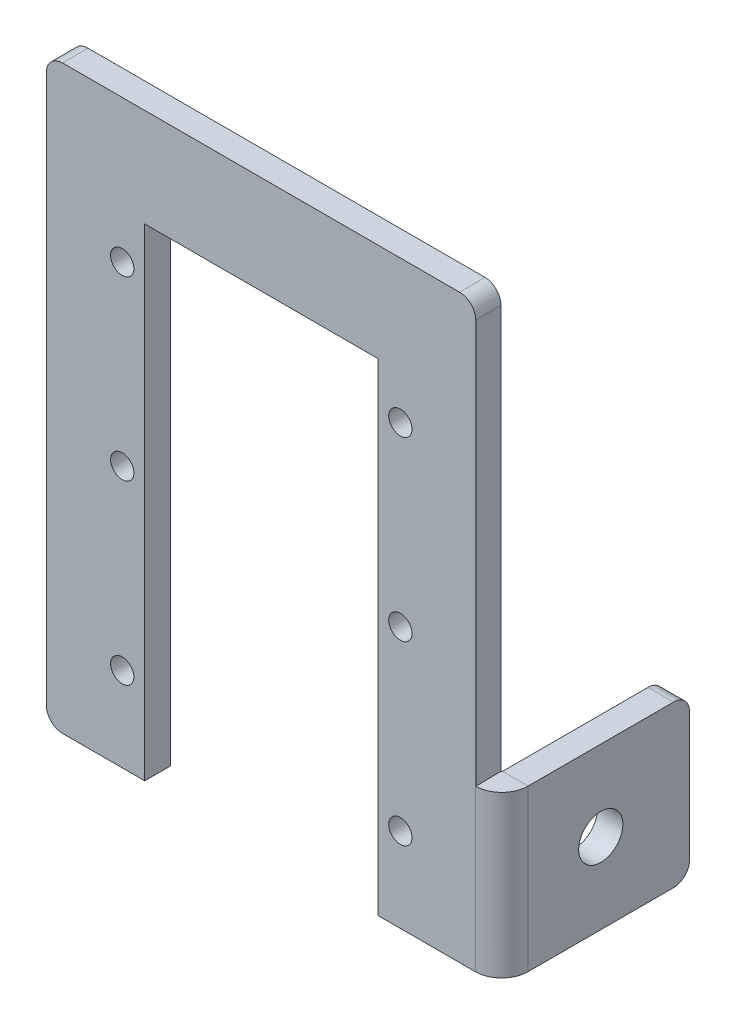
ISO-10303-21;
HEADER;
FILE_DESCRIPTION(('STEP AP214'),'2;1');
FILE_NAME('part.step','',(''),(''),'','','');
FILE_SCHEMA(('AUTOMOTIVE_DESIGN { 1 0 10303 214 1 1 1 1 }'));
ENDSEC;
DATA;
#1=APPLICATION_CONTEXT('core data for automotive mechanical design processes');
#2=APPLICATION_PROTOCOL_DEFINITION('international standard','automotive_design',2000,#1);
#3=PRODUCT_CONTEXT('',#1,'mechanical');
#4=PRODUCT('Part','Part','',(#3));
#5=PRODUCT_RELATED_PRODUCT_CATEGORY('part','',(#4));
#6=PRODUCT_DEFINITION_FORMATION('','',#4);
#7=PRODUCT_DEFINITION_CONTEXT('part definition',#1,'design');
#8=PRODUCT_DEFINITION('design','',#6,#7);
#9=PRODUCT_DEFINITION_SHAPE('','',#8);
#10=(LENGTH_UNIT() NAMED_UNIT(*) SI_UNIT(.MILLI.,.METRE.));
#11=(NAMED_UNIT(*) PLANE_ANGLE_UNIT() SI_UNIT($,.RADIAN.));
#12=(NAMED_UNIT(*) SI_UNIT($,.STERADIAN.) SOLID_ANGLE_UNIT());
#13=UNCERTAINTY_MEASURE_WITH_UNIT(LENGTH_MEASURE(1.E-05),#10,'distance_accuracy_value','');
#14=(GEOMETRIC_REPRESENTATION_CONTEXT(3) GLOBAL_UNCERTAINTY_ASSIGNED_CONTEXT((#13)) GLOBAL_UNIT_ASSIGNED_CONTEXT((#10,
#11,#12)) REPRESENTATION_CONTEXT('',''));
#15=CARTESIAN_POINT('',(0.,0.,0.));
#16=DIRECTION('',(0.,0.,1.));
#17=DIRECTION('',(1.,0.,0.));
#18=AXIS2_PLACEMENT_3D('',#15,#16,#17);
#19=CARTESIAN_POINT('',(26.7316212801133,-30.,6.625));
#20=DIRECTION('',(0.,1.,0.));
#21=DIRECTION('',(1.,0.,0.));
#22=AXIS2_PLACEMENT_3D('',#19,#20,#21);
#23=PLANE('',#22);
#24=DIRECTION('',(0.,0.,1.));
#25=VECTOR('',#24,1.);
#26=CARTESIAN_POINT('',(29.9066212801133,-30.,6.62499999999999));
#27=LINE('',#26,#25);
#28=CARTESIAN_POINT('',(29.9066212801132,-30.,-21.375));
#29=VERTEX_POINT('',#28);
#30=CARTESIAN_POINT('',(29.9066212801132,-30.,-3.27500000000002));
#31=VERTEX_POINT('',#30);
#32=EDGE_CURVE('E211',#29,#31,#27,.T.);
#33=ORIENTED_EDGE('',*,*,#32,.F.);
#34=DIRECTION('',(1.,0.,0.));
#35=VECTOR('',#34,1.);
#36=CARTESIAN_POINT('',(26.7316212801132,-30.,-21.375));
#37=LINE('',#36,#35);
#38=CARTESIAN_POINT('',(26.7316212801132,-30.,-21.375));
#39=VERTEX_POINT('',#38);
#40=EDGE_CURVE('E265',#29,#39,#37,.F.);
#41=ORIENTED_EDGE('',*,*,#40,.T.);
#42=DIRECTION('',(0.,0.,1.));
#43=VECTOR('',#42,1.);
#44=CARTESIAN_POINT('',(26.7316212801133,-30.,6.625));
#45=LINE('',#44,#43);
#46=CARTESIAN_POINT('',(26.7316212801132,-30.,-3.27499999999999));
#47=VERTEX_POINT('',#46);
#48=EDGE_CURVE('E188',#39,#47,#45,.T.);
#49=ORIENTED_EDGE('',*,*,#48,.T.);
#50=DIRECTION('',(1.,0.,0.));
#51=VECTOR('',#50,1.);
#52=CARTESIAN_POINT('',(26.7316212801132,-30.,-3.27499999999999));
#53=LINE('',#52,#51);
#54=EDGE_CURVE('E221',#47,#31,#53,.T.);
#55=ORIENTED_EDGE('',*,*,#54,.T.);
#56=EDGE_LOOP('',(#33,#41,#49,#55));
#57=FACE_BOUND('',#56,.T.);
#58=ADVANCED_FACE('F42',(#57),#23,.T.);
#59=CARTESIAN_POINT('',(26.7316212801132,-50.,-23.375));
#60=DIRECTION('',(0.,-1.,0.));
#61=DIRECTION('',(0.,0.,-1.));
#62=AXIS2_PLACEMENT_3D('',#59,#60,#61);
#63=PLANE('',#62);
#64=DIRECTION('',(0.,0.,-1.));
#65=VECTOR('',#64,1.);
#66=CARTESIAN_POINT('',(26.7316212801132,-50.,-23.375));
#67=LINE('',#66,#65);
#68=CARTESIAN_POINT('',(26.7316212801132,-50.,-3.275));
#69=VERTEX_POINT('',#68);
#70=CARTESIAN_POINT('',(26.7316212801132,-50.,-21.375));
#71=VERTEX_POINT('',#70);
#72=EDGE_CURVE('E202',#69,#71,#67,.T.);
#73=ORIENTED_EDGE('',*,*,#72,.T.);
#74=DIRECTION('',(1.,0.,0.));
#75=VECTOR('',#74,1.);
#76=CARTESIAN_POINT('',(26.7316212801132,-50.,-21.375));
#77=LINE('',#76,#75);
#78=CARTESIAN_POINT('',(29.9066212801132,-50.,-21.375));
#79=VERTEX_POINT('',#78);
#80=EDGE_CURVE('E251',#71,#79,#77,.T.);
#81=ORIENTED_EDGE('',*,*,#80,.T.);
#82=DIRECTION('',(0.,0.,-1.));
#83=VECTOR('',#82,1.);
#84=CARTESIAN_POINT('',(29.9066212801132,-50.,-23.375));
#85=LINE('',#84,#83);
#86=CARTESIAN_POINT('',(29.9066212801132,-50.,-3.27500000000003));
#87=VERTEX_POINT('',#86);
#88=EDGE_CURVE('E216',#87,#79,#85,.T.);
#89=ORIENTED_EDGE('',*,*,#88,.F.);
#90=DIRECTION('',(-1.,0.,0.));
#91=VECTOR('',#90,1.);
#92=CARTESIAN_POINT('',(26.7316212801132,-50.,-3.275));
#93=LINE('',#92,#91);
#94=EDGE_CURVE('E187',#87,#69,#93,.T.);
#95=ORIENTED_EDGE('',*,*,#94,.T.);
#96=EDGE_LOOP('',(#73,#81,#89,#95));
#97=FACE_BOUND('',#96,.T.);
#98=ADVANCED_FACE('F214',(#97),#63,.T.);
#99=CARTESIAN_POINT('',(26.7316212801134,0.,33.3566212801132));
#100=DIRECTION('',(-1.,0.,0.));
#101=DIRECTION('',(0.,0.,1.));
#102=AXIS2_PLACEMENT_3D('',#99,#100,#101);
#103=PLANE('',#102);
#104=CARTESIAN_POINT('',(26.7316212801132,-40.,-12.325));
#105=DIRECTION('',(-1.,0.,0.));
#106=DIRECTION('',(0.,0.,1.));
#107=AXIS2_PLACEMENT_3D('',#104,#105,#106);
#108=CIRCLE('',#107,2.75);
#109=CARTESIAN_POINT('',(26.7316212801132,-40.,-9.57499999999999));
#110=VERTEX_POINT('',#109);
#111=EDGE_CURVE('E453',#110,#110,#108,.T.);
#112=ORIENTED_EDGE('',*,*,#111,.F.);
#113=EDGE_LOOP('',(#112));
#114=FACE_BOUND('',#113,.T.);
#115=DIRECTION('',(0.,1.,0.));
#116=VECTOR('',#115,1.);
#117=CARTESIAN_POINT('',(26.7316212801132,-30.,-23.375));
#118=LINE('',#117,#116);
#119=CARTESIAN_POINT('',(26.7316212801132,-48.,-23.375));
#120=VERTEX_POINT('',#119);
#121=CARTESIAN_POINT('',(26.7316212801132,-32.,-23.375));
#122=VERTEX_POINT('',#121);
#123=EDGE_CURVE('E210',#120,#122,#118,.T.);
#124=ORIENTED_EDGE('',*,*,#123,.F.);
#125=CARTESIAN_POINT('',(26.7316212801132,-48.,-21.375));
#126=DIRECTION('',(-1.,0.,0.));
#127=DIRECTION('',(0.,0.,1.));
#128=AXIS2_PLACEMENT_3D('',#125,#126,#127);
#129=CIRCLE('',#128,2.);
#130=EDGE_CURVE('E206',#120,#71,#129,.T.);
#131=ORIENTED_EDGE('',*,*,#130,.T.);
#132=ORIENTED_EDGE('',*,*,#72,.F.);
#133=DIRECTION('',(0.,1.,0.));
#134=VECTOR('',#133,1.);
#135=CARTESIAN_POINT('',(26.7316212801132,0.,-3.27499999999999));
#136=LINE('',#135,#134);
#137=EDGE_CURVE('E177',#69,#47,#136,.T.);
#138=ORIENTED_EDGE('',*,*,#137,.T.);
#139=ORIENTED_EDGE('',*,*,#48,.F.);
#140=CARTESIAN_POINT('',(26.7316212801132,-32.,-21.375));
#141=DIRECTION('',(-1.,0.,0.));
#142=DIRECTION('',(0.,0.,1.));
#143=AXIS2_PLACEMENT_3D('',#140,#141,#142);
#144=CIRCLE('',#143,2.);
#145=EDGE_CURVE('E262',#39,#122,#144,.T.);
#146=ORIENTED_EDGE('',*,*,#145,.T.);
#147=EDGE_LOOP('',(#124,#131,#132,#138,#139,#146));
#148=FACE_BOUND('',#147,.T.);
#149=ADVANCED_FACE('F204',(#114,#148),#103,.T.);
#150=CARTESIAN_POINT('',(26.7316212801132,-30.,-23.375));
#151=DIRECTION('',(0.,0.,-1.));
#152=DIRECTION('',(-1.,0.,0.));
#153=AXIS2_PLACEMENT_3D('',#150,#151,#152);
#154=PLANE('',#153);
#155=DIRECTION('',(0.,1.,0.));
#156=VECTOR('',#155,1.);
#157=CARTESIAN_POINT('',(29.9066212801132,-30.,-23.375));
#158=LINE('',#157,#156);
#159=CARTESIAN_POINT('',(29.9066212801132,-48.,-23.375));
#160=VERTEX_POINT('',#159);
#161=CARTESIAN_POINT('',(29.9066212801132,-32.,-23.375));
#162=VERTEX_POINT('',#161);
#163=EDGE_CURVE('E230',#160,#162,#158,.T.);
#164=ORIENTED_EDGE('',*,*,#163,.F.);
#165=DIRECTION('',(1.,0.,0.));
#166=VECTOR('',#165,1.);
#167=CARTESIAN_POINT('',(26.7316212801132,-48.,-23.375));
#168=LINE('',#167,#166);
#169=EDGE_CURVE('E260',#160,#120,#168,.F.);
#170=ORIENTED_EDGE('',*,*,#169,.T.);
#171=ORIENTED_EDGE('',*,*,#123,.T.);
#172=DIRECTION('',(1.,0.,0.));
#173=VECTOR('',#172,1.);
#174=CARTESIAN_POINT('',(26.7316212801132,-32.,-23.375));
#175=LINE('',#174,#173);
#176=EDGE_CURVE('E257',#122,#162,#175,.T.);
#177=ORIENTED_EDGE('',*,*,#176,.T.);
#178=EDGE_LOOP('',(#164,#170,#171,#177));
#179=FACE_BOUND('',#178,.T.);
#180=ADVANCED_FACE('F334',(#179),#154,.T.);
#181=CARTESIAN_POINT('',(29.9066212801134,0.,33.3566212801132));
#182=DIRECTION('',(-1.,0.,0.));
#183=DIRECTION('',(0.,0.,1.));
#184=AXIS2_PLACEMENT_3D('',#181,#182,#183);
#185=PLANE('',#184);
#186=CARTESIAN_POINT('',(29.9066212801133,-40.,-12.325));
#187=DIRECTION('',(-1.,0.,0.));
#188=DIRECTION('',(0.,0.,1.));
#189=AXIS2_PLACEMENT_3D('',#186,#187,#188);
#190=CIRCLE('',#189,2.75);
#191=CARTESIAN_POINT('',(29.9066212801133,-40.,-9.575));
#192=VERTEX_POINT('',#191);
#193=EDGE_CURVE('E449',#192,#192,#190,.T.);
#194=ORIENTED_EDGE('',*,*,#193,.T.);
#195=EDGE_LOOP('',(#194));
#196=FACE_BOUND('',#195,.T.);
#197=ORIENTED_EDGE('',*,*,#88,.T.);
#198=CARTESIAN_POINT('',(29.9066212801132,-48.,-21.375));
#199=DIRECTION('',(-1.,0.,0.));
#200=DIRECTION('',(0.,0.,1.));
#201=AXIS2_PLACEMENT_3D('',#198,#199,#200);
#202=CIRCLE('',#201,2.);
#203=EDGE_CURVE('E255',#79,#160,#202,.F.);
#204=ORIENTED_EDGE('',*,*,#203,.T.);
#205=ORIENTED_EDGE('',*,*,#163,.T.);
#206=CARTESIAN_POINT('',(29.9066212801132,-32.,-21.375));
#207=DIRECTION('',(-1.,0.,0.));
#208=DIRECTION('',(0.,0.,1.));
#209=AXIS2_PLACEMENT_3D('',#206,#207,#208);
#210=CIRCLE('',#209,2.);
#211=EDGE_CURVE('E253',#162,#29,#210,.F.);
#212=ORIENTED_EDGE('',*,*,#211,.T.);
#213=ORIENTED_EDGE('',*,*,#32,.T.);
#214=DIRECTION('',(0.,1.,0.));
#215=VECTOR('',#214,1.);
#216=CARTESIAN_POINT('',(29.9066212801132,0.,-3.275));
#217=LINE('',#216,#215);
#218=EDGE_CURVE('E218',#87,#31,#217,.T.);
#219=ORIENTED_EDGE('',*,*,#218,.F.);
#220=EDGE_LOOP('',(#197,#204,#205,#212,#213,#219));
#221=FACE_BOUND('',#220,.T.);
#222=ADVANCED_FACE('F302',(#196,#221),#185,.F.);
#223=CARTESIAN_POINT('',(-26.7316212801132,22.2316212801132,-3.175));
#224=DIRECTION('',(-1.,0.,0.));
#225=DIRECTION('',(0.,-1.,0.));
#226=AXIS2_PLACEMENT_3D('',#223,#224,#225);
#227=PLANE('',#226);
#228=DIRECTION('',(0.,-1.,0.));
#229=VECTOR('',#228,1.);
#230=CARTESIAN_POINT('',(-26.7316212801132,22.2316212801132,-3.175));
#231=LINE('',#230,#229);
#232=CARTESIAN_POINT('',(-26.7316212801132,20.2316212801132,-3.175));
#233=VERTEX_POINT('',#232);
#234=CARTESIAN_POINT('',(-26.7316212801132,-48.,-3.175));
#235=VERTEX_POINT('',#234);
#236=EDGE_CURVE('E375',#233,#235,#231,.T.);
#237=ORIENTED_EDGE('',*,*,#236,.T.);
#238=DIRECTION('',(0.,0.,1.));
#239=VECTOR('',#238,1.);
#240=CARTESIAN_POINT('',(-26.7316212801132,-48.,-3.175));
#241=LINE('',#240,#239);
#242=CARTESIAN_POINT('',(-26.7316212801132,-48.,0.));
#243=VERTEX_POINT('',#242);
#244=EDGE_CURVE('E234',#235,#243,#241,.T.);
#245=ORIENTED_EDGE('',*,*,#244,.T.);
#246=DIRECTION('',(0.,-1.,0.));
#247=VECTOR('',#246,1.);
#248=CARTESIAN_POINT('',(-26.7316212801132,22.2316212801132,0.));
#249=LINE('',#248,#247);
#250=CARTESIAN_POINT('',(-26.7316212801132,20.2316212801132,0.));
#251=VERTEX_POINT('',#250);
#252=EDGE_CURVE('E395',#251,#243,#249,.T.);
#253=ORIENTED_EDGE('',*,*,#252,.F.);
#254=DIRECTION('',(0.,0.,1.));
#255=VECTOR('',#254,1.);
#256=CARTESIAN_POINT('',(-26.7316212801132,20.2316212801132,-3.175));
#257=LINE('',#256,#255);
#258=EDGE_CURVE('E227',#251,#233,#257,.F.);
#259=ORIENTED_EDGE('',*,*,#258,.T.);
#260=EDGE_LOOP('',(#237,#245,#253,#259));
#261=FACE_BOUND('',#260,.T.);
#262=ADVANCED_FACE('F298',(#261),#227,.T.);
#263=CARTESIAN_POINT('',(-26.7316212801132,-50.,-3.175));
#264=DIRECTION('',(0.,-1.,0.));
#265=DIRECTION('',(1.,0.,0.));
#266=AXIS2_PLACEMENT_3D('',#263,#264,#265);
#267=PLANE('',#266);
#268=DIRECTION('',(1.,0.,0.));
#269=VECTOR('',#268,1.);
#270=CARTESIAN_POINT('',(-26.7316212801132,-50.,0.));
#271=LINE('',#270,#269);
#272=CARTESIAN_POINT('',(-24.7316212801132,-50.,0.));
#273=VERTEX_POINT('',#272);
#274=CARTESIAN_POINT('',(-14.5,-50.,0.));
#275=VERTEX_POINT('',#274);
#276=EDGE_CURVE('E393',#273,#275,#271,.T.);
#277=ORIENTED_EDGE('',*,*,#276,.F.);
#278=DIRECTION('',(0.,0.,1.));
#279=VECTOR('',#278,1.);
#280=CARTESIAN_POINT('',(-24.7316212801132,-50.,-3.175));
#281=LINE('',#280,#279);
#282=CARTESIAN_POINT('',(-24.7316212801132,-50.,-3.175));
#283=VERTEX_POINT('',#282);
#284=EDGE_CURVE('E243',#273,#283,#281,.F.);
#285=ORIENTED_EDGE('',*,*,#284,.T.);
#286=DIRECTION('',(1.,0.,0.));
#287=VECTOR('',#286,1.);
#288=CARTESIAN_POINT('',(-26.7316212801132,-50.,-3.175));
#289=LINE('',#288,#287);
#290=CARTESIAN_POINT('',(-14.5,-50.,-3.175));
#291=VERTEX_POINT('',#290);
#292=EDGE_CURVE('E425',#283,#291,#289,.T.);
#293=ORIENTED_EDGE('',*,*,#292,.T.);
#294=DIRECTION('',(0.,0.,1.));
#295=VECTOR('',#294,1.);
#296=CARTESIAN_POINT('',(-14.5,-50.,-3.175));
#297=LINE('',#296,#295);
#298=EDGE_CURVE('E422',#291,#275,#297,.T.);
#299=ORIENTED_EDGE('',*,*,#298,.T.);
#300=EDGE_LOOP('',(#277,#285,#293,#299));
#301=FACE_BOUND('',#300,.T.);
#302=ADVANCED_FACE('F301',(#301),#267,.T.);
#303=CARTESIAN_POINT('',(-14.5,-50.,-3.175));
#304=DIRECTION('',(1.,0.,0.));
#305=DIRECTION('',(0.,0.,-1.));
#306=AXIS2_PLACEMENT_3D('',#303,#304,#305);
#307=PLANE('',#306);
#308=DIRECTION('',(0.,1.,0.));
#309=VECTOR('',#308,1.);
#310=CARTESIAN_POINT('',(-14.5,-50.,0.));
#311=LINE('',#310,#309);
#312=CARTESIAN_POINT('',(-14.5,10.,0.));
#313=VERTEX_POINT('',#312);
#314=EDGE_CURVE('E390',#275,#313,#311,.T.);
#315=ORIENTED_EDGE('',*,*,#314,.F.);
#316=ORIENTED_EDGE('',*,*,#298,.F.);
#317=DIRECTION('',(0.,1.,0.));
#318=VECTOR('',#317,1.);
#319=CARTESIAN_POINT('',(-14.5,-50.,-3.175));
#320=LINE('',#319,#318);
#321=CARTESIAN_POINT('',(-14.5,10.,-3.175));
#322=VERTEX_POINT('',#321);
#323=EDGE_CURVE('E419',#291,#322,#320,.T.);
#324=ORIENTED_EDGE('',*,*,#323,.T.);
#325=DIRECTION('',(0.,0.,1.));
#326=VECTOR('',#325,1.);
#327=CARTESIAN_POINT('',(-14.5,10.,-3.175));
#328=LINE('',#327,#326);
#329=EDGE_CURVE('E417',#322,#313,#328,.T.);
#330=ORIENTED_EDGE('',*,*,#329,.T.);
#331=EDGE_LOOP('',(#315,#316,#324,#330));
#332=FACE_BOUND('',#331,.T.);
#333=ADVANCED_FACE('F306',(#332),#307,.T.);
#334=CARTESIAN_POINT('',(-14.5,10.,-3.175));
#335=DIRECTION('',(0.,-1.,0.));
#336=DIRECTION('',(0.,0.,-1.));
#337=AXIS2_PLACEMENT_3D('',#334,#335,#336);
#338=PLANE('',#337);
#339=DIRECTION('',(1.,0.,0.));
#340=VECTOR('',#339,1.);
#341=CARTESIAN_POINT('',(-14.5,10.,0.));
#342=LINE('',#341,#340);
#343=CARTESIAN_POINT('',(14.5,10.,0.));
#344=VERTEX_POINT('',#343);
#345=EDGE_CURVE('E382',#313,#344,#342,.T.);
#346=ORIENTED_EDGE('',*,*,#345,.F.);
#347=ORIENTED_EDGE('',*,*,#329,.F.);
#348=DIRECTION('',(1.,0.,0.));
#349=VECTOR('',#348,1.);
#350=CARTESIAN_POINT('',(-14.5,10.,-3.175));
#351=LINE('',#350,#349);
#352=CARTESIAN_POINT('',(14.5,10.,-3.175));
#353=VERTEX_POINT('',#352);
#354=EDGE_CURVE('E414',#322,#353,#351,.T.);
#355=ORIENTED_EDGE('',*,*,#354,.T.);
#356=DIRECTION('',(0.,0.,1.));
#357=VECTOR('',#356,1.);
#358=CARTESIAN_POINT('',(14.5,10.,-3.175));
#359=LINE('',#358,#357);
#360=EDGE_CURVE('E412',#353,#344,#359,.T.);
#361=ORIENTED_EDGE('',*,*,#360,.T.);
#362=EDGE_LOOP('',(#346,#347,#355,#361));
#363=FACE_BOUND('',#362,.T.);
#364=ADVANCED_FACE('F310',(#363),#338,.T.);
#365=CARTESIAN_POINT('',(14.5,10.,-3.175));
#366=DIRECTION('',(-1.,0.,0.));
#367=DIRECTION('',(0.,-1.,0.));
#368=AXIS2_PLACEMENT_3D('',#365,#366,#367);
#369=PLANE('',#368);
#370=DIRECTION('',(0.,-1.,0.));
#371=VECTOR('',#370,1.);
#372=CARTESIAN_POINT('',(14.5,10.,0.));
#373=LINE('',#372,#371);
#374=CARTESIAN_POINT('',(14.5,-50.,0.));
#375=VERTEX_POINT('',#374);
#376=EDGE_CURVE('E379',#344,#375,#373,.T.);
#377=ORIENTED_EDGE('',*,*,#376,.F.);
#378=ORIENTED_EDGE('',*,*,#360,.F.);
#379=DIRECTION('',(0.,-1.,0.));
#380=VECTOR('',#379,1.);
#381=CARTESIAN_POINT('',(14.5,10.,-3.175));
#382=LINE('',#381,#380);
#383=CARTESIAN_POINT('',(14.5,-50.,-3.175));
#384=VERTEX_POINT('',#383);
#385=EDGE_CURVE('E409',#353,#384,#382,.T.);
#386=ORIENTED_EDGE('',*,*,#385,.T.);
#387=DIRECTION('',(0.,0.,1.));
#388=VECTOR('',#387,1.);
#389=CARTESIAN_POINT('',(14.5,-50.,-3.175));
#390=LINE('',#389,#388);
#391=EDGE_CURVE('E407',#384,#375,#390,.T.);
#392=ORIENTED_EDGE('',*,*,#391,.T.);
#393=EDGE_LOOP('',(#377,#378,#386,#392));
#394=FACE_BOUND('',#393,.T.);
#395=ADVANCED_FACE('F314',(#394),#369,.T.);
#396=CARTESIAN_POINT('',(0.,0.,-3.175));
#397=DIRECTION('',(0.,0.,-1.));
#398=DIRECTION('',(-1.,0.,0.));
#399=AXIS2_PLACEMENT_3D('',#396,#397,#398);
#400=PLANE('',#399);
#401=CARTESIAN_POINT('',(17.3,4.49999999999998,-3.175));
#402=DIRECTION('',(0.,0.,-1.));
#403=DIRECTION('',(-1.,0.,0.));
#404=AXIS2_PLACEMENT_3D('',#401,#402,#403);
#405=CIRCLE('',#404,1.45);
#406=CARTESIAN_POINT('',(15.85,4.49999999999998,-3.175));
#407=VERTEX_POINT('',#406);
#408=EDGE_CURVE('E491',#407,#407,#405,.T.);
#409=ORIENTED_EDGE('',*,*,#408,.F.);
#410=EDGE_LOOP('',(#409));
#411=FACE_BOUND('',#410,.T.);
#412=CARTESIAN_POINT('',(17.3,-17.5,-3.175));
#413=DIRECTION('',(0.,0.,-1.));
#414=DIRECTION('',(-1.,0.,0.));
#415=AXIS2_PLACEMENT_3D('',#412,#413,#414);
#416=CIRCLE('',#415,1.45);
#417=CARTESIAN_POINT('',(15.85,-17.5,-3.175));
#418=VERTEX_POINT('',#417);
#419=EDGE_CURVE('E485',#418,#418,#416,.T.);
#420=ORIENTED_EDGE('',*,*,#419,.F.);
#421=EDGE_LOOP('',(#420));
#422=FACE_BOUND('',#421,.T.);
#423=CARTESIAN_POINT('',(17.3,-39.5,-3.175));
#424=DIRECTION('',(0.,0.,-1.));
#425=DIRECTION('',(-1.,0.,0.));
#426=AXIS2_PLACEMENT_3D('',#423,#424,#425);
#427=CIRCLE('',#426,1.45);
#428=CARTESIAN_POINT('',(15.85,-39.5,-3.175));
#429=VERTEX_POINT('',#428);
#430=EDGE_CURVE('E479',#429,#429,#427,.T.);
#431=ORIENTED_EDGE('',*,*,#430,.F.);
#432=EDGE_LOOP('',(#431));
#433=FACE_BOUND('',#432,.T.);
#434=CARTESIAN_POINT('',(-17.3,-39.5,-3.175));
#435=DIRECTION('',(0.,0.,-1.));
#436=DIRECTION('',(-1.,0.,0.));
#437=AXIS2_PLACEMENT_3D('',#434,#435,#436);
#438=CIRCLE('',#437,1.45);
#439=CARTESIAN_POINT('',(-18.75,-39.5,-3.175));
#440=VERTEX_POINT('',#439);
#441=EDGE_CURVE('E473',#440,#440,#438,.T.);
#442=ORIENTED_EDGE('',*,*,#441,.F.);
#443=EDGE_LOOP('',(#442));
#444=FACE_BOUND('',#443,.T.);
#445=CARTESIAN_POINT('',(-17.3,-17.5,-3.175));
#446=DIRECTION('',(0.,0.,-1.));
#447=DIRECTION('',(-1.,0.,0.));
#448=AXIS2_PLACEMENT_3D('',#445,#446,#447);
#449=CIRCLE('',#448,1.45);
#450=CARTESIAN_POINT('',(-18.75,-17.5,-3.175));
#451=VERTEX_POINT('',#450);
#452=EDGE_CURVE('E467',#451,#451,#449,.T.);
#453=ORIENTED_EDGE('',*,*,#452,.F.);
#454=EDGE_LOOP('',(#453));
#455=FACE_BOUND('',#454,.T.);
#456=CARTESIAN_POINT('',(-17.3,4.49999999999998,-3.175));
#457=DIRECTION('',(0.,0.,-1.));
#458=DIRECTION('',(-1.,0.,0.));
#459=AXIS2_PLACEMENT_3D('',#456,#457,#458);
#460=CIRCLE('',#459,1.45);
#461=CARTESIAN_POINT('',(-18.75,4.49999999999998,-3.175));
#462=VERTEX_POINT('',#461);
#463=EDGE_CURVE('E461',#462,#462,#460,.T.);
#464=ORIENTED_EDGE('',*,*,#463,.F.);
#465=EDGE_LOOP('',(#464));
#466=FACE_BOUND('',#465,.T.);
#467=ORIENTED_EDGE('',*,*,#292,.F.);
#468=CARTESIAN_POINT('',(-24.7316212801132,-48.,-3.175));
#469=DIRECTION('',(0.,0.,-1.));
#470=DIRECTION('',(-1.,0.,0.));
#471=AXIS2_PLACEMENT_3D('',#468,#469,#470);
#472=CIRCLE('',#471,2.);
#473=EDGE_CURVE('E249',#283,#235,#472,.T.);
#474=ORIENTED_EDGE('',*,*,#473,.T.);
#475=ORIENTED_EDGE('',*,*,#236,.F.);
#476=CARTESIAN_POINT('',(-24.7316212801133,20.2316212801132,-3.175));
#477=DIRECTION('',(0.,0.,-1.));
#478=DIRECTION('',(-1.,0.,0.));
#479=AXIS2_PLACEMENT_3D('',#476,#477,#478);
#480=CIRCLE('',#479,2.);
#481=CARTESIAN_POINT('',(-24.7316212801133,22.2316212801132,-3.175));
#482=VERTEX_POINT('',#481);
#483=EDGE_CURVE('E247',#233,#482,#480,.T.);
#484=ORIENTED_EDGE('',*,*,#483,.T.);
#485=DIRECTION('',(-1.,0.,0.));
#486=VECTOR('',#485,1.);
#487=CARTESIAN_POINT('',(26.7316212801132,22.2316212801132,-3.175));
#488=LINE('',#487,#486);
#489=CARTESIAN_POINT('',(24.6329454401661,22.2316212801132,-3.175));
#490=VERTEX_POINT('',#489);
#491=EDGE_CURVE('E231',#490,#482,#488,.T.);
#492=ORIENTED_EDGE('',*,*,#491,.F.);
#493=CARTESIAN_POINT('',(24.6329454401661,20.2316212801132,-3.175));
#494=DIRECTION('',(0.,0.,-1.));
#495=DIRECTION('',(1.,0.,0.));
#496=AXIS2_PLACEMENT_3D('',#493,#494,#495);
#497=ELLIPSE('',#496,2.00024676547952,2.);
#498=CARTESIAN_POINT('',(26.6316212801132,20.3108706316975,-3.175));
#499=VERTEX_POINT('',#498);
#500=EDGE_CURVE('E245',#490,#499,#497,.T.);
#501=ORIENTED_EDGE('',*,*,#500,.T.);
#502=DIRECTION('',(0.,1.,0.));
#503=VECTOR('',#502,1.);
#504=CARTESIAN_POINT('',(26.6316212801132,0.,-3.175));
#505=LINE('',#504,#503);
#506=CARTESIAN_POINT('',(26.6316212801132,-50.,-3.175));
#507=VERTEX_POINT('',#506);
#508=EDGE_CURVE('E429',#507,#499,#505,.T.);
#509=ORIENTED_EDGE('',*,*,#508,.F.);
#510=DIRECTION('',(1.,0.,0.));
#511=VECTOR('',#510,1.);
#512=CARTESIAN_POINT('',(56.7316212801132,-50.,-3.175));
#513=LINE('',#512,#511);
#514=EDGE_CURVE('E405',#384,#507,#513,.T.);
#515=ORIENTED_EDGE('',*,*,#514,.F.);
#516=ORIENTED_EDGE('',*,*,#385,.F.);
#517=ORIENTED_EDGE('',*,*,#354,.F.);
#518=ORIENTED_EDGE('',*,*,#323,.F.);
#519=EDGE_LOOP('',(#467,#474,#475,#484,#492,#501,#509,#515,#516,#517,#518));
#520=FACE_BOUND('',#519,.T.);
#521=ADVANCED_FACE('F318',(#411,#422,#433,#444,#455,#466,#520),#400,.T.);
#522=CARTESIAN_POINT('',(56.7316212801132,-50.,-3.175));
#523=DIRECTION('',(0.,-1.,0.));
#524=DIRECTION('',(1.,0.,0.));
#525=AXIS2_PLACEMENT_3D('',#522,#523,#524);
#526=PLANE('',#525);
#527=DIRECTION('',(0.,0.,-1.));
#528=VECTOR('',#527,1.);
#529=CARTESIAN_POINT('',(26.6316212801132,-50.,-3.175));
#530=LINE('',#529,#528);
#531=CARTESIAN_POINT('',(26.6316212801132,-50.,0.));
#532=VERTEX_POINT('',#531);
#533=EDGE_CURVE('E197',#532,#507,#530,.T.);
#534=ORIENTED_EDGE('',*,*,#533,.F.);
#535=DIRECTION('',(1.,0.,0.));
#536=VECTOR('',#535,1.);
#537=CARTESIAN_POINT('',(56.7316212801132,-50.,0.));
#538=LINE('',#537,#536);
#539=EDGE_CURVE('E403',#375,#532,#538,.T.);
#540=ORIENTED_EDGE('',*,*,#539,.F.);
#541=ORIENTED_EDGE('',*,*,#391,.F.);
#542=ORIENTED_EDGE('',*,*,#514,.T.);
#543=EDGE_LOOP('',(#534,#540,#541,#542));
#544=FACE_BOUND('',#543,.T.);
#545=ADVANCED_FACE('F322',(#544),#526,.T.);
#546=CARTESIAN_POINT('',(0.,0.,0.));
#547=DIRECTION('',(0.,0.,-1.));
#548=DIRECTION('',(-1.,0.,0.));
#549=AXIS2_PLACEMENT_3D('',#546,#547,#548);
#550=PLANE('',#549);
#551=CARTESIAN_POINT('',(17.3,4.49999999999998,0.));
#552=DIRECTION('',(0.,0.,-1.));
#553=DIRECTION('',(-1.,0.,0.));
#554=AXIS2_PLACEMENT_3D('',#551,#552,#553);
#555=CIRCLE('',#554,1.45);
#556=CARTESIAN_POINT('',(15.85,4.49999999999998,0.));
#557=VERTEX_POINT('',#556);
#558=EDGE_CURVE('E488',#557,#557,#555,.T.);
#559=ORIENTED_EDGE('',*,*,#558,.T.);
#560=EDGE_LOOP('',(#559));
#561=FACE_BOUND('',#560,.T.);
#562=CARTESIAN_POINT('',(17.3,-17.5,0.));
#563=DIRECTION('',(0.,0.,-1.));
#564=DIRECTION('',(-1.,0.,0.));
#565=AXIS2_PLACEMENT_3D('',#562,#563,#564);
#566=CIRCLE('',#565,1.45);
#567=CARTESIAN_POINT('',(15.85,-17.5,0.));
#568=VERTEX_POINT('',#567);
#569=EDGE_CURVE('E482',#568,#568,#566,.T.);
#570=ORIENTED_EDGE('',*,*,#569,.T.);
#571=EDGE_LOOP('',(#570));
#572=FACE_BOUND('',#571,.T.);
#573=CARTESIAN_POINT('',(17.3,-39.5,0.));
#574=DIRECTION('',(0.,0.,-1.));
#575=DIRECTION('',(-1.,0.,0.));
#576=AXIS2_PLACEMENT_3D('',#573,#574,#575);
#577=CIRCLE('',#576,1.45);
#578=CARTESIAN_POINT('',(15.85,-39.5,0.));
#579=VERTEX_POINT('',#578);
#580=EDGE_CURVE('E476',#579,#579,#577,.T.);
#581=ORIENTED_EDGE('',*,*,#580,.T.);
#582=EDGE_LOOP('',(#581));
#583=FACE_BOUND('',#582,.T.);
#584=CARTESIAN_POINT('',(-17.3,-39.5,0.));
#585=DIRECTION('',(0.,0.,-1.));
#586=DIRECTION('',(-1.,0.,0.));
#587=AXIS2_PLACEMENT_3D('',#584,#585,#586);
#588=CIRCLE('',#587,1.45);
#589=CARTESIAN_POINT('',(-18.75,-39.5,0.));
#590=VERTEX_POINT('',#589);
#591=EDGE_CURVE('E470',#590,#590,#588,.T.);
#592=ORIENTED_EDGE('',*,*,#591,.T.);
#593=EDGE_LOOP('',(#592));
#594=FACE_BOUND('',#593,.T.);
#595=CARTESIAN_POINT('',(-17.3,-17.5,0.));
#596=DIRECTION('',(0.,0.,-1.));
#597=DIRECTION('',(-1.,0.,0.));
#598=AXIS2_PLACEMENT_3D('',#595,#596,#597);
#599=CIRCLE('',#598,1.45);
#600=CARTESIAN_POINT('',(-18.75,-17.5,0.));
#601=VERTEX_POINT('',#600);
#602=EDGE_CURVE('E464',#601,#601,#599,.T.);
#603=ORIENTED_EDGE('',*,*,#602,.T.);
#604=EDGE_LOOP('',(#603));
#605=FACE_BOUND('',#604,.T.);
#606=CARTESIAN_POINT('',(-17.3,4.49999999999998,0.));
#607=DIRECTION('',(0.,0.,-1.));
#608=DIRECTION('',(-1.,0.,0.));
#609=AXIS2_PLACEMENT_3D('',#606,#607,#608);
#610=CIRCLE('',#609,1.45);
#611=CARTESIAN_POINT('',(-18.75,4.49999999999998,0.));
#612=VERTEX_POINT('',#611);
#613=EDGE_CURVE('E456',#612,#612,#610,.T.);
#614=ORIENTED_EDGE('',*,*,#613,.T.);
#615=EDGE_LOOP('',(#614));
#616=FACE_BOUND('',#615,.T.);
#617=ORIENTED_EDGE('',*,*,#252,.T.);
#618=CARTESIAN_POINT('',(-24.7316212801132,-48.,0.));
#619=DIRECTION('',(0.,0.,-1.));
#620=DIRECTION('',(-1.,0.,0.));
#621=AXIS2_PLACEMENT_3D('',#618,#619,#620);
#622=CIRCLE('',#621,2.);
#623=EDGE_CURVE('E241',#243,#273,#622,.F.);
#624=ORIENTED_EDGE('',*,*,#623,.T.);
#625=ORIENTED_EDGE('',*,*,#276,.T.);
#626=ORIENTED_EDGE('',*,*,#314,.T.);
#627=ORIENTED_EDGE('',*,*,#345,.T.);
#628=ORIENTED_EDGE('',*,*,#376,.T.);
#629=ORIENTED_EDGE('',*,*,#539,.T.);
#630=DIRECTION('',(0.,1.,0.));
#631=VECTOR('',#630,1.);
#632=CARTESIAN_POINT('',(26.6316212801132,0.,0.));
#633=LINE('',#632,#631);
#634=CARTESIAN_POINT('',(26.6316212801132,20.682309234851,0.));
#635=VERTEX_POINT('',#634);
#636=EDGE_CURVE('E400',#532,#635,#633,.T.);
#637=ORIENTED_EDGE('',*,*,#636,.T.);
#638=CARTESIAN_POINT('',(24.6828223258186,20.2316212801132,0.));
#639=DIRECTION('',(0.,0.,-1.));
#640=DIRECTION('',(1.,0.,0.));
#641=AXIS2_PLACEMENT_3D('',#638,#639,#640);
#642=ELLIPSE('',#641,2.00024676547952,2.);
#643=CARTESIAN_POINT('',(24.6828223258186,22.2316212801132,0.));
#644=VERTEX_POINT('',#643);
#645=EDGE_CURVE('E237',#635,#644,#642,.F.);
#646=ORIENTED_EDGE('',*,*,#645,.T.);
#647=DIRECTION('',(-1.,0.,0.));
#648=VECTOR('',#647,1.);
#649=CARTESIAN_POINT('',(26.7316212801132,22.2316212801132,0.));
#650=LINE('',#649,#648);
#651=CARTESIAN_POINT('',(-24.7316212801133,22.2316212801132,0.));
#652=VERTEX_POINT('',#651);
#653=EDGE_CURVE('E398',#644,#652,#650,.T.);
#654=ORIENTED_EDGE('',*,*,#653,.T.);
#655=CARTESIAN_POINT('',(-24.7316212801133,20.2316212801132,0.));
#656=DIRECTION('',(0.,0.,-1.));
#657=DIRECTION('',(-1.,0.,0.));
#658=AXIS2_PLACEMENT_3D('',#655,#656,#657);
#659=CIRCLE('',#658,2.);
#660=EDGE_CURVE('E239',#652,#251,#659,.F.);
#661=ORIENTED_EDGE('',*,*,#660,.T.);
#662=EDGE_LOOP('',(#617,#624,#625,#626,#627,#628,#629,#637,#646,#654,#661));
#663=FACE_BOUND('',#662,.T.);
#664=ADVANCED_FACE('F326',(#561,#572,#583,#594,#605,#616,#663),#550,.F.);
#665=CARTESIAN_POINT('',(26.7316212801132,22.2316212801132,-3.175));
#666=DIRECTION('',(0.,1.,0.));
#667=DIRECTION('',(0.,0.,1.));
#668=AXIS2_PLACEMENT_3D('',#665,#666,#667);
#669=PLANE('',#668);
#670=ORIENTED_EDGE('',*,*,#491,.T.);
#671=DIRECTION('',(0.,0.,1.));
#672=VECTOR('',#671,1.);
#673=CARTESIAN_POINT('',(-24.7316212801133,22.2316212801132,-3.175));
#674=LINE('',#673,#672);
#675=EDGE_CURVE('E270',#482,#652,#674,.T.);
#676=ORIENTED_EDGE('',*,*,#675,.T.);
#677=ORIENTED_EDGE('',*,*,#653,.F.);
#678=DIRECTION('',(0.0157073173117847,0.,0.999876632481661));
#679=VECTOR('',#678,1.);
#680=CARTESIAN_POINT('',(24.6334632250855,22.2316212801132,-3.14203949940424));
#681=LINE('',#680,#679);
#682=EDGE_CURVE('E267',#644,#490,#681,.F.);
#683=ORIENTED_EDGE('',*,*,#682,.T.);
#684=EDGE_LOOP('',(#670,#676,#677,#683));
#685=FACE_BOUND('',#684,.T.);
#686=ADVANCED_FACE('F294',(#685),#669,.T.);
#687=CARTESIAN_POINT('',(26.6316212801132,-50.,-3.275));
#688=DIRECTION('',(0.,1.,0.));
#689=DIRECTION('',(0.,0.,1.));
#690=AXIS2_PLACEMENT_3D('',#687,#688,#689);
#691=PLANE('',#690);
#692=ORIENTED_EDGE('',*,*,#94,.F.);
#693=CARTESIAN_POINT('',(26.6316212801132,-50.,-3.275));
#694=DIRECTION('',(0.,-1.,0.));
#695=DIRECTION('',(1.,0.,0.));
#696=AXIS2_PLACEMENT_3D('',#693,#694,#695);
#697=CIRCLE('',#696,3.275);
#698=EDGE_CURVE('E441',#87,#532,#697,.T.);
#699=ORIENTED_EDGE('',*,*,#698,.T.);
#700=ORIENTED_EDGE('',*,*,#533,.T.);
#701=CARTESIAN_POINT('',(26.6316212801132,-50.,-3.275));
#702=DIRECTION('',(0.,-1.,0.));
#703=DIRECTION('',(0.,0.,1.));
#704=AXIS2_PLACEMENT_3D('',#701,#702,#703);
#705=CIRCLE('',#704,0.0999999999999996);
#706=EDGE_CURVE('E180',#69,#507,#705,.T.);
#707=ORIENTED_EDGE('',*,*,#706,.F.);
#708=EDGE_LOOP('',(#692,#699,#700,#707));
#709=FACE_BOUND('',#708,.T.);
#710=ADVANCED_FACE('F192',(#709),#691,.F.);
#711=CARTESIAN_POINT('',(26.6331920118444,-3.88418935994338,-3.17501233675183));
#712=DIRECTION('',(-0.999876632481661,0.,0.0157073173117847));
#713=DIRECTION('',(0.,-1.,0.));
#714=AXIS2_PLACEMENT_3D('',#711,#712,#713);
#715=PLANE('',#714);
#716=DIRECTION('',(0.,-1.,0.));
#717=VECTOR('',#716,1.);
#718=CARTESIAN_POINT('',(26.6331920118444,-30.,-3.17501233675183));
#719=LINE('',#718,#717);
#720=CARTESIAN_POINT('',(26.6331920118444,20.2316212801132,-3.17501233675183));
#721=VERTEX_POINT('',#720);
#722=CARTESIAN_POINT('',(26.6331920118444,-30.,-3.17501233675183));
#723=VERTEX_POINT('',#722);
#724=EDGE_CURVE('E198',#721,#723,#719,.T.);
#725=ORIENTED_EDGE('',*,*,#724,.F.);
#726=DIRECTION('',(-0.0157073173117847,0.,-0.999876632481661));
#727=VECTOR('',#726,1.);
#728=CARTESIAN_POINT('',(26.6331920118444,20.2316212801132,-3.17501233675183));
#729=LINE('',#728,#727);
#730=CARTESIAN_POINT('',(26.6830627443093,20.2316212801132,-0.000404028622558606));
#731=VERTEX_POINT('',#730);
#732=EDGE_CURVE('E55',#721,#731,#729,.F.);
#733=ORIENTED_EDGE('',*,*,#732,.T.);
#734=DIRECTION('',(0.,-1.,0.));
#735=VECTOR('',#734,1.);
#736=CARTESIAN_POINT('',(26.6830627443093,59.1054519445164,-0.000404028622558606));
#737=LINE('',#736,#735);
#738=CARTESIAN_POINT('',(26.6830627443092,-30.,-0.000404028622557739));
#739=VERTEX_POINT('',#738);
#740=EDGE_CURVE('E444',#731,#739,#737,.T.);
#741=ORIENTED_EDGE('',*,*,#740,.T.);
#742=DIRECTION('',(-0.0157073173117523,0.,-0.999876632481662));
#743=VECTOR('',#742,1.);
#744=CARTESIAN_POINT('',(26.6331920118444,-30.,-3.17501233675183));
#745=LINE('',#744,#743);
#746=EDGE_CURVE('E385',#739,#723,#745,.T.);
#747=ORIENTED_EDGE('',*,*,#746,.T.);
#748=EDGE_LOOP('',(#725,#733,#741,#747));
#749=FACE_BOUND('',#748,.T.);
#750=ADVANCED_FACE('F289',(#749),#715,.F.);
#751=CARTESIAN_POINT('',(26.6316212801132,-30.,-3.275));
#752=DIRECTION('',(0.,-1.,0.));
#753=DIRECTION('',(0.,0.,-1.));
#754=AXIS2_PLACEMENT_3D('',#751,#752,#753);
#755=PLANE('',#754);
#756=CARTESIAN_POINT('',(26.6316212801132,-30.,-3.275));
#757=DIRECTION('',(0.,-1.,0.));
#758=DIRECTION('',(1.,0.,0.));
#759=AXIS2_PLACEMENT_3D('',#756,#757,#758);
#760=CIRCLE('',#759,3.275);
#761=EDGE_CURVE('E199',#739,#31,#760,.F.);
#762=ORIENTED_EDGE('',*,*,#761,.T.);
#763=ORIENTED_EDGE('',*,*,#54,.F.);
#764=CARTESIAN_POINT('',(26.6316212801132,-30.,-3.275));
#765=DIRECTION('',(0.,1.,0.));
#766=DIRECTION('',(0.,0.,-1.));
#767=AXIS2_PLACEMENT_3D('',#764,#765,#766);
#768=CIRCLE('',#767,0.0999999999999997);
#769=EDGE_CURVE('E182',#723,#47,#768,.T.);
#770=ORIENTED_EDGE('',*,*,#769,.F.);
#771=ORIENTED_EDGE('',*,*,#746,.F.);
#772=EDGE_LOOP('',(#762,#763,#770,#771));
#773=FACE_BOUND('',#772,.T.);
#774=ADVANCED_FACE('F281',(#773),#755,.F.);
#775=CARTESIAN_POINT('',(26.6316212801132,59.1054519445164,-3.275));
#776=DIRECTION('',(0.,-1.,0.));
#777=DIRECTION('',(1.,0.,0.));
#778=AXIS2_PLACEMENT_3D('',#775,#776,#777);
#779=CYLINDRICAL_SURFACE('',#778,0.1);
#780=ORIENTED_EDGE('',*,*,#508,.T.);
#781=CARTESIAN_POINT('',(26.6316212801132,20.3108706316975,-3.175));
#782=CARTESIAN_POINT('',(26.6321448558643,20.297667595186,-3.17500257001419));
#783=CARTESIAN_POINT('',(26.6325375380507,20.2844619643083,-3.17500488308394));
#784=CARTESIAN_POINT('',(26.6330611152952,20.2580455137802,-3.17500899533455));
#785=CARTESIAN_POINT('',(26.6331920103525,20.2448346941299,-3.17501079451542));
#786=CARTESIAN_POINT('',(26.6331920118444,20.2316212801132,-3.17501233675183));
#787=B_SPLINE_CURVE_WITH_KNOTS('',3,(#781,#782,#783,#784,#785,#786),.UNSPECIFIED.,.F.,.F.,(4,2,
4),(0.,0.0396344045466501,0.0792688092132867),.UNSPECIFIED.);
#788=EDGE_CURVE('E69',#499,#721,#787,.T.);
#789=ORIENTED_EDGE('',*,*,#788,.T.);
#790=ORIENTED_EDGE('',*,*,#724,.T.);
#791=ORIENTED_EDGE('',*,*,#769,.T.);
#792=ORIENTED_EDGE('',*,*,#137,.F.);
#793=ORIENTED_EDGE('',*,*,#706,.T.);
#794=EDGE_LOOP('',(#780,#789,#790,#791,#792,#793));
#795=FACE_BOUND('',#794,.T.);
#796=ADVANCED_FACE('F179',(#795),#779,.F.);
#797=CARTESIAN_POINT('',(26.6316212801132,59.1054519445164,-3.275));
#798=DIRECTION('',(0.,-1.,0.));
#799=DIRECTION('',(1.,0.,0.));
#800=AXIS2_PLACEMENT_3D('',#797,#798,#799);
#801=CYLINDRICAL_SURFACE('',#800,3.275);
#802=ORIENTED_EDGE('',*,*,#740,.F.);
#803=CARTESIAN_POINT('',(26.6830627443093,20.2316212801132,-0.00040402862255947));
#804=CARTESIAN_POINT('',(26.6830638704008,20.269565144943,-0.000406169742828526));
#805=CARTESIAN_POINT('',(26.681983075847,20.3075088756464,-0.000387065374192086));
#806=CARTESIAN_POINT('',(26.6776730689805,20.3831515696086,-0.000322560958849576));
#807=CARTESIAN_POINT('',(26.6744507822214,20.4208509276019,-0.000277245738700674));
#808=CARTESIAN_POINT('',(26.6658730899428,20.4960061883386,-0.00017632177072756));
#809=CARTESIAN_POINT('',(26.6605176841277,20.5334620910481,-0.00012071302147658));
#810=CARTESIAN_POINT('',(26.6476714679349,20.608130463547,-3.350377342011E-05));
#811=CARTESIAN_POINT('',(26.6401738185281,20.6453417568415,-1.98137294540336E-06));
#812=CARTESIAN_POINT('',(26.6316212801132,20.682309234851,0.));
#813=B_SPLINE_CURVE_WITH_KNOTS('',3,(#803,#804,#805,#806,#807,#808,#809,#810,#811,#812),
.UNSPECIFIED.,.F.,.F.,(4,2,2,2,4),(0.,0.113815985516007,0.22726567142883,0.340715373066735,
0.454531384650052),.UNSPECIFIED.);
#814=EDGE_CURVE('E12',#731,#635,#813,.T.);
#815=ORIENTED_EDGE('',*,*,#814,.T.);
#816=ORIENTED_EDGE('',*,*,#636,.F.);
#817=ORIENTED_EDGE('',*,*,#698,.F.);
#818=ORIENTED_EDGE('',*,*,#218,.T.);
#819=ORIENTED_EDGE('',*,*,#761,.F.);
#820=EDGE_LOOP('',(#802,#815,#816,#817,#818,#819));
#821=FACE_BOUND('',#820,.T.);
#822=ADVANCED_FACE('F280',(#821),#801,.T.);
#823=CARTESIAN_POINT('',(-24.7316212801132,-48.,-3.175));
#824=DIRECTION('',(0.,0.,1.));
#825=DIRECTION('',(1.,0.,0.));
#826=AXIS2_PLACEMENT_3D('',#823,#824,#825);
#827=CYLINDRICAL_SURFACE('',#826,2.);
#828=ORIENTED_EDGE('',*,*,#473,.F.);
#829=ORIENTED_EDGE('',*,*,#284,.F.);
#830=ORIENTED_EDGE('',*,*,#623,.F.);
#831=ORIENTED_EDGE('',*,*,#244,.F.);
#832=EDGE_LOOP('',(#828,#829,#830,#831));
#833=FACE_BOUND('',#832,.T.);
#834=ADVANCED_FACE('F287',(#833),#827,.T.);
#835=CARTESIAN_POINT('',(26.7316212801132,-48.,-21.375));
#836=DIRECTION('',(1.,0.,0.));
#837=DIRECTION('',(0.,0.,-1.));
#838=AXIS2_PLACEMENT_3D('',#835,#836,#837);
#839=CYLINDRICAL_SURFACE('',#838,2.);
#840=ORIENTED_EDGE('',*,*,#130,.F.);
#841=ORIENTED_EDGE('',*,*,#169,.F.);
#842=ORIENTED_EDGE('',*,*,#203,.F.);
#843=ORIENTED_EDGE('',*,*,#80,.F.);
#844=EDGE_LOOP('',(#840,#841,#842,#843));
#845=FACE_BOUND('',#844,.T.);
#846=ADVANCED_FACE('F351',(#845),#839,.T.);
#847=CARTESIAN_POINT('',(26.7316212801132,-32.,-21.375));
#848=DIRECTION('',(1.,0.,0.));
#849=DIRECTION('',(0.,0.,-1.));
#850=AXIS2_PLACEMENT_3D('',#847,#848,#849);
#851=CYLINDRICAL_SURFACE('',#850,2.);
#852=ORIENTED_EDGE('',*,*,#145,.F.);
#853=ORIENTED_EDGE('',*,*,#40,.F.);
#854=ORIENTED_EDGE('',*,*,#211,.F.);
#855=ORIENTED_EDGE('',*,*,#176,.F.);
#856=EDGE_LOOP('',(#852,#853,#854,#855));
#857=FACE_BOUND('',#856,.T.);
#858=ADVANCED_FACE('F355',(#857),#851,.T.);
#859=CARTESIAN_POINT('',(-24.7316212801133,20.2316212801132,-3.175));
#860=DIRECTION('',(0.,0.,1.));
#861=DIRECTION('',(1.,0.,0.));
#862=AXIS2_PLACEMENT_3D('',#859,#860,#861);
#863=CYLINDRICAL_SURFACE('',#862,2.);
#864=ORIENTED_EDGE('',*,*,#483,.F.);
#865=ORIENTED_EDGE('',*,*,#258,.F.);
#866=ORIENTED_EDGE('',*,*,#660,.F.);
#867=ORIENTED_EDGE('',*,*,#675,.F.);
#868=EDGE_LOOP('',(#864,#865,#866,#867));
#869=FACE_BOUND('',#868,.T.);
#870=ADVANCED_FACE('F358',(#869),#863,.T.);
#871=CARTESIAN_POINT('',(24.6334632250855,20.2316212801132,-3.14203949940424));
#872=DIRECTION('',(0.0157073173117847,0.,0.999876632481661));
#873=DIRECTION('',(0.999876632481661,0.,-0.0157073173117847));
#874=AXIS2_PLACEMENT_3D('',#871,#872,#873);
#875=CYLINDRICAL_SURFACE('',#874,2.);
#876=ORIENTED_EDGE('',*,*,#814,.F.);
#877=ORIENTED_EDGE('',*,*,#732,.F.);
#878=ORIENTED_EDGE('',*,*,#788,.F.);
#879=ORIENTED_EDGE('',*,*,#500,.F.);
#880=ORIENTED_EDGE('',*,*,#682,.F.);
#881=ORIENTED_EDGE('',*,*,#645,.F.);
#882=EDGE_LOOP('',(#876,#877,#878,#879,#880,#881));
#883=FACE_BOUND('',#882,.T.);
#884=ADVANCED_FACE('F44',(#883),#875,.T.);
#885=CARTESIAN_POINT('',(29.9066212801133,-40.,-12.325));
#886=DIRECTION('',(-1.,0.,0.));
#887=DIRECTION('',(0.,0.,1.));
#888=AXIS2_PLACEMENT_3D('',#885,#886,#887);
#889=CYLINDRICAL_SURFACE('',#888,2.75);
#890=ORIENTED_EDGE('',*,*,#193,.F.);
#891=EDGE_LOOP('',(#890));
#892=FACE_BOUND('',#891,.T.);
#893=ORIENTED_EDGE('',*,*,#111,.T.);
#894=EDGE_LOOP('',(#893));
#895=FACE_BOUND('',#894,.T.);
#896=ADVANCED_FACE('F282',(#892,#895),#889,.F.);
#897=CARTESIAN_POINT('',(-17.3,4.49999999999998,-3.175));
#898=DIRECTION('',(0.,0.,-1.));
#899=DIRECTION('',(-1.,0.,0.));
#900=AXIS2_PLACEMENT_3D('',#897,#898,#899);
#901=CYLINDRICAL_SURFACE('',#900,1.45);
#902=ORIENTED_EDGE('',*,*,#613,.F.);
#903=EDGE_LOOP('',(#902));
#904=FACE_BOUND('',#903,.T.);
#905=ORIENTED_EDGE('',*,*,#463,.T.);
#906=EDGE_LOOP('',(#905));
#907=FACE_BOUND('',#906,.T.);
#908=ADVANCED_FACE('F507',(#904,#907),#901,.F.);
#909=CARTESIAN_POINT('',(-17.3,-17.5,-3.175));
#910=DIRECTION('',(0.,0.,-1.));
#911=DIRECTION('',(-1.,0.,0.));
#912=AXIS2_PLACEMENT_3D('',#909,#910,#911);
#913=CYLINDRICAL_SURFACE('',#912,1.45);
#914=ORIENTED_EDGE('',*,*,#602,.F.);
#915=EDGE_LOOP('',(#914));
#916=FACE_BOUND('',#915,.T.);
#917=ORIENTED_EDGE('',*,*,#452,.T.);
#918=EDGE_LOOP('',(#917));
#919=FACE_BOUND('',#918,.T.);
#920=ADVANCED_FACE('F509',(#916,#919),#913,.F.);
#921=CARTESIAN_POINT('',(-17.3,-39.5,-3.175));
#922=DIRECTION('',(0.,0.,-1.));
#923=DIRECTION('',(-1.,0.,0.));
#924=AXIS2_PLACEMENT_3D('',#921,#922,#923);
#925=CYLINDRICAL_SURFACE('',#924,1.45);
#926=ORIENTED_EDGE('',*,*,#591,.F.);
#927=EDGE_LOOP('',(#926));
#928=FACE_BOUND('',#927,.T.);
#929=ORIENTED_EDGE('',*,*,#441,.T.);
#930=EDGE_LOOP('',(#929));
#931=FACE_BOUND('',#930,.T.);
#932=ADVANCED_FACE('F515',(#928,#931),#925,.F.);
#933=CARTESIAN_POINT('',(17.3,-39.5,-3.175));
#934=DIRECTION('',(0.,0.,-1.));
#935=DIRECTION('',(-1.,0.,0.));
#936=AXIS2_PLACEMENT_3D('',#933,#934,#935);
#937=CYLINDRICAL_SURFACE('',#936,1.45);
#938=ORIENTED_EDGE('',*,*,#580,.F.);
#939=EDGE_LOOP('',(#938));
#940=FACE_BOUND('',#939,.T.);
#941=ORIENTED_EDGE('',*,*,#430,.T.);
#942=EDGE_LOOP('',(#941));
#943=FACE_BOUND('',#942,.T.);
#944=ADVANCED_FACE('F523',(#940,#943),#937,.F.);
#945=CARTESIAN_POINT('',(17.3,-17.5,-3.175));
#946=DIRECTION('',(0.,0.,-1.));
#947=DIRECTION('',(-1.,0.,0.));
#948=AXIS2_PLACEMENT_3D('',#945,#946,#947);
#949=CYLINDRICAL_SURFACE('',#948,1.45);
#950=ORIENTED_EDGE('',*,*,#569,.F.);
#951=EDGE_LOOP('',(#950));
#952=FACE_BOUND('',#951,.T.);
#953=ORIENTED_EDGE('',*,*,#419,.T.);
#954=EDGE_LOOP('',(#953));
#955=FACE_BOUND('',#954,.T.);
#956=ADVANCED_FACE('F527',(#952,#955),#949,.F.);
#957=CARTESIAN_POINT('',(17.3,4.49999999999998,-3.175));
#958=DIRECTION('',(0.,0.,-1.));
#959=DIRECTION('',(-1.,0.,0.));
#960=AXIS2_PLACEMENT_3D('',#957,#958,#959);
#961=CYLINDRICAL_SURFACE('',#960,1.45);
#962=ORIENTED_EDGE('',*,*,#558,.F.);
#963=EDGE_LOOP('',(#962));
#964=FACE_BOUND('',#963,.T.);
#965=ORIENTED_EDGE('',*,*,#408,.T.);
#966=EDGE_LOOP('',(#965));
#967=FACE_BOUND('',#966,.T.);
#968=ADVANCED_FACE('F495',(#964,#967),#961,.F.);
#969=CLOSED_SHELL('',(#58,#98,#149,#180,#222,#262,#302,#333,#364,#395,#521,#545,#664,#686,#710,
#750,#774,#796,#822,#834,#846,#858,#870,#884,#896,#908,#920,#932,#944,#956,#968));
#970=MANIFOLD_SOLID_BREP('B2',#969);
#971=ADVANCED_BREP_SHAPE_REPRESENTATION('',(#18,#970),#14);
#972=SHAPE_DEFINITION_REPRESENTATION(#9,#971);
ENDSEC;
END-ISO-10303-21;
